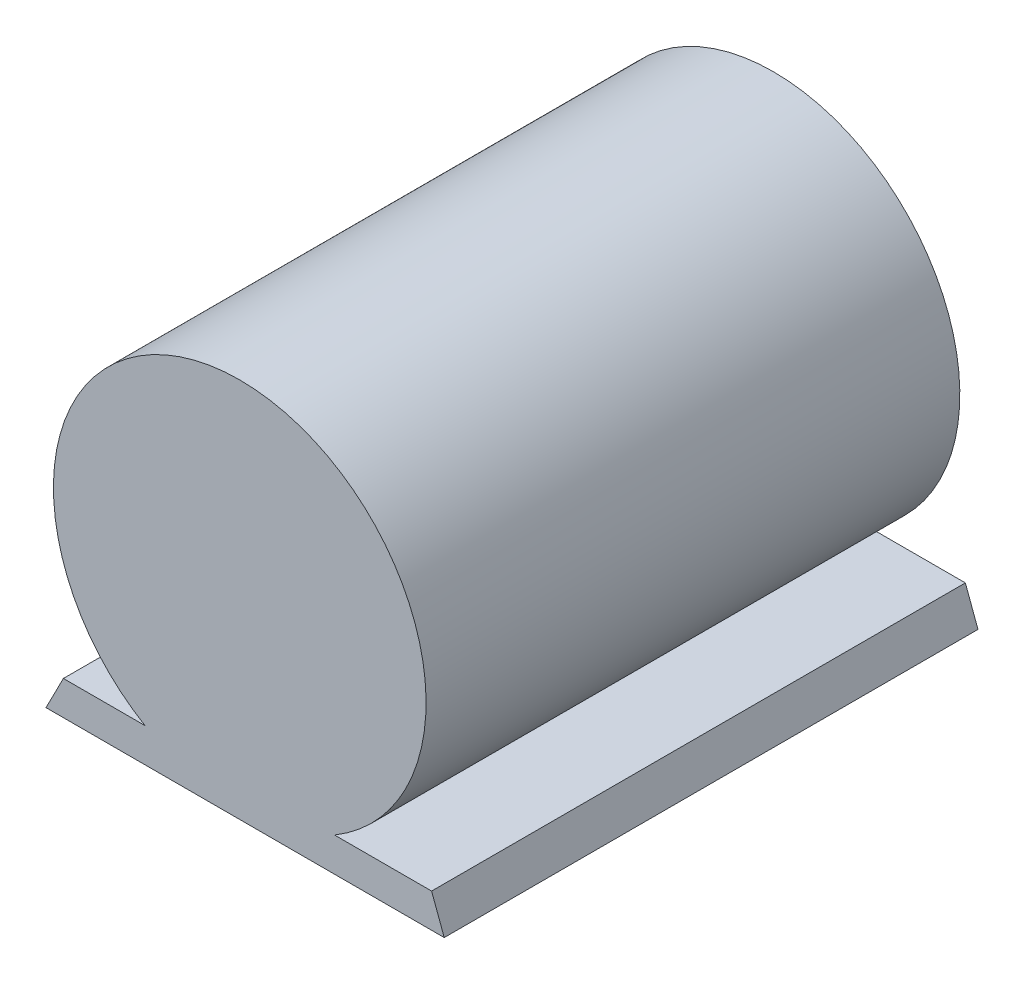
ISO-10303-21;
HEADER;
FILE_DESCRIPTION(('STEP AP214'),'2;1');
FILE_NAME('part.step','',(''),(''),'','','');
FILE_SCHEMA(('AUTOMOTIVE_DESIGN { 1 0 10303 214 1 1 1 1 }'));
ENDSEC;
DATA;
#1=APPLICATION_CONTEXT('core data for automotive mechanical design processes');
#2=APPLICATION_PROTOCOL_DEFINITION('international standard','automotive_design',2000,#1);
#3=PRODUCT_CONTEXT('',#1,'mechanical');
#4=PRODUCT('Part','Part','',(#3));
#5=PRODUCT_RELATED_PRODUCT_CATEGORY('part','',(#4));
#6=PRODUCT_DEFINITION_FORMATION('','',#4);
#7=PRODUCT_DEFINITION_CONTEXT('part definition',#1,'design');
#8=PRODUCT_DEFINITION('design','',#6,#7);
#9=PRODUCT_DEFINITION_SHAPE('','',#8);
#10=(LENGTH_UNIT() NAMED_UNIT(*) SI_UNIT(.MILLI.,.METRE.));
#11=(NAMED_UNIT(*) PLANE_ANGLE_UNIT() SI_UNIT($,.RADIAN.));
#12=(NAMED_UNIT(*) SI_UNIT($,.STERADIAN.) SOLID_ANGLE_UNIT());
#13=UNCERTAINTY_MEASURE_WITH_UNIT(LENGTH_MEASURE(1.E-05),#10,'distance_accuracy_value','');
#14=(GEOMETRIC_REPRESENTATION_CONTEXT(3) GLOBAL_UNCERTAINTY_ASSIGNED_CONTEXT((#13)) GLOBAL_UNIT_ASSIGNED_CONTEXT((#10,
#11,#12)) REPRESENTATION_CONTEXT('',''));
#15=CARTESIAN_POINT('',(0.,0.,0.));
#16=DIRECTION('',(0.,0.,1.));
#17=DIRECTION('',(1.,0.,0.));
#18=AXIS2_PLACEMENT_3D('',#15,#16,#17);
#19=CARTESIAN_POINT('',(0.,0.,167.));
#20=DIRECTION('',(0.,0.,-1.));
#21=DIRECTION('',(-1.,0.,0.));
#22=AXIS2_PLACEMENT_3D('',#19,#20,#21);
#23=CYLINDRICAL_SURFACE('',#22,65.);
#24=CARTESIAN_POINT('',(0.,0.,167.));
#25=DIRECTION('',(0.,0.,-1.));
#26=DIRECTION('',(-1.,0.,0.));
#27=AXIS2_PLACEMENT_3D('',#24,#25,#26);
#28=CIRCLE('',#27,65.);
#29=CARTESIAN_POINT('',(-65.,0.,167.));
#30=VERTEX_POINT('',#29);
#31=EDGE_CURVE('E261',#30,#30,#28,.T.);
#32=ORIENTED_EDGE('',*,*,#31,.F.);
#33=EDGE_LOOP('',(#32));
#34=FACE_BOUND('',#33,.T.);
#35=DIRECTION('',(0.,0.,-1.));
#36=VECTOR('',#35,1.);
#37=CARTESIAN_POINT('',(-48.6955872409807,-43.0550784839145,167.));
#38=LINE('',#37,#36);
#39=CARTESIAN_POINT('',(-48.6955872409807,-43.0550784839145,81.));
#40=VERTEX_POINT('',#39);
#41=CARTESIAN_POINT('',(-48.6955872409807,-43.0550784839145,83.9999999999999));
#42=VERTEX_POINT('',#41);
#43=EDGE_CURVE('E196',#40,#42,#38,.F.);
#44=ORIENTED_EDGE('',*,*,#43,.F.);
#45=CARTESIAN_POINT('',(0.,0.,81.));
#46=DIRECTION('',(0.,0.,-1.));
#47=DIRECTION('',(-1.,0.,0.));
#48=AXIS2_PLACEMENT_3D('',#45,#46,#47);
#49=CIRCLE('',#48,65.);
#50=CARTESIAN_POINT('',(-50.4248756332916,-41.0162396785356,81.));
#51=VERTEX_POINT('',#50);
#52=EDGE_CURVE('E185',#51,#40,#49,.F.);
#53=ORIENTED_EDGE('',*,*,#52,.F.);
#54=DIRECTION('',(0.,0.,-1.));
#55=VECTOR('',#54,1.);
#56=CARTESIAN_POINT('',(-50.4248756332916,-41.0162396785356,81.));
#57=LINE('',#56,#55);
#58=CARTESIAN_POINT('',(-50.4248756332916,-41.0162396785356,0.));
#59=VERTEX_POINT('',#58);
#60=EDGE_CURVE('E288',#51,#59,#57,.T.);
#61=ORIENTED_EDGE('',*,*,#60,.T.);
#62=CARTESIAN_POINT('',(0.,0.,0.));
#63=DIRECTION('',(0.,0.,-1.));
#64=DIRECTION('',(-1.,0.,0.));
#65=AXIS2_PLACEMENT_3D('',#62,#63,#64);
#66=CIRCLE('',#65,65.);
#67=CARTESIAN_POINT('',(50.4248756332916,-41.0162396785356,0.));
#68=VERTEX_POINT('',#67);
#69=EDGE_CURVE('E277',#59,#68,#66,.T.);
#70=ORIENTED_EDGE('',*,*,#69,.T.);
#71=DIRECTION('',(0.,0.,-1.));
#72=VECTOR('',#71,1.);
#73=CARTESIAN_POINT('',(50.4248756332916,-41.0162396785356,81.));
#74=LINE('',#73,#72);
#75=CARTESIAN_POINT('',(50.4248756332916,-41.0162396785356,81.));
#76=VERTEX_POINT('',#75);
#77=EDGE_CURVE('E285',#76,#68,#74,.T.);
#78=ORIENTED_EDGE('',*,*,#77,.F.);
#79=CARTESIAN_POINT('',(48.6955872409807,-43.0550784839145,81.));
#80=VERTEX_POINT('',#79);
#81=EDGE_CURVE('E194',#80,#76,#49,.F.);
#82=ORIENTED_EDGE('',*,*,#81,.F.);
#83=DIRECTION('',(0.,0.,-1.));
#84=VECTOR('',#83,1.);
#85=CARTESIAN_POINT('',(48.6955872409807,-43.0550784839145,167.));
#86=LINE('',#85,#84);
#87=CARTESIAN_POINT('',(48.6955872409807,-43.0550784839145,83.9999999999999));
#88=VERTEX_POINT('',#87);
#89=EDGE_CURVE('E57',#88,#80,#86,.T.);
#90=ORIENTED_EDGE('',*,*,#89,.F.);
#91=CARTESIAN_POINT('',(0.,0.,83.9999999999999));
#92=DIRECTION('',(0.,0.,1.));
#93=DIRECTION('',(1.,0.,0.));
#94=AXIS2_PLACEMENT_3D('',#91,#92,#93);
#95=CIRCLE('',#94,65.);
#96=EDGE_CURVE('E11',#88,#42,#95,.F.);
#97=ORIENTED_EDGE('',*,*,#96,.T.);
#98=EDGE_LOOP('',(#44,#53,#61,#70,#78,#82,#90,#97));
#99=FACE_BOUND('',#98,.T.);
#100=ADVANCED_FACE('F39',(#34,#99),#23,.F.);
#101=CARTESIAN_POINT('',(0.,0.,81.));
#102=DIRECTION('',(0.,0.,-1.));
#103=DIRECTION('',(-1.,0.,0.));
#104=AXIS2_PLACEMENT_3D('',#101,#102,#103);
#105=PLANE('',#104);
#106=DIRECTION('',(-1.,0.,0.));
#107=VECTOR('',#106,1.);
#108=CARTESIAN_POINT('',(0.,-43.0550784839145,81.));
#109=LINE('',#108,#107);
#110=CARTESIAN_POINT('',(46.0736904584768,-43.0550784839145,81.));
#111=VERTEX_POINT('',#110);
#112=EDGE_CURVE('E47',#80,#111,#109,.T.);
#113=ORIENTED_EDGE('',*,*,#112,.F.);
#114=ORIENTED_EDGE('',*,*,#81,.T.);
#115=DIRECTION('',(-1.,0.,0.));
#116=VECTOR('',#115,1.);
#117=CARTESIAN_POINT('',(0.,-41.0162396785356,81.));
#118=LINE('',#117,#116);
#119=CARTESIAN_POINT('',(47.8977329145388,-41.0162396785356,81.));
#120=VERTEX_POINT('',#119);
#121=EDGE_CURVE('E299',#76,#120,#118,.T.);
#122=ORIENTED_EDGE('',*,*,#121,.T.);
#123=CARTESIAN_POINT('',(0.,0.,81.));
#124=DIRECTION('',(0.,0.,-1.));
#125=DIRECTION('',(-1.,0.,0.));
#126=AXIS2_PLACEMENT_3D('',#123,#124,#125);
#127=CIRCLE('',#126,63.0596918460562);
#128=EDGE_CURVE('E301',#120,#111,#127,.T.);
#129=ORIENTED_EDGE('',*,*,#128,.T.);
#130=EDGE_LOOP('',(#113,#114,#122,#129));
#131=FACE_BOUND('',#130,.T.);
#132=ADVANCED_FACE('F357',(#131),#105,.F.);
#133=CARTESIAN_POINT('',(-46.0736904584768,-43.0550784839145,81.));
#134=VERTEX_POINT('',#133);
#135=EDGE_CURVE('E188',#134,#40,#109,.T.);
#136=ORIENTED_EDGE('',*,*,#135,.F.);
#137=CARTESIAN_POINT('',(-47.8977329145388,-41.0162396785356,81.));
#138=VERTEX_POINT('',#137);
#139=EDGE_CURVE('E305',#134,#138,#127,.T.);
#140=ORIENTED_EDGE('',*,*,#139,.T.);
#141=EDGE_CURVE('E191',#138,#51,#118,.T.);
#142=ORIENTED_EDGE('',*,*,#141,.T.);
#143=ORIENTED_EDGE('',*,*,#52,.T.);
#144=EDGE_LOOP('',(#136,#140,#142,#143));
#145=FACE_BOUND('',#144,.T.);
#146=ADVANCED_FACE('F186',(#145),#105,.F.);
#147=CARTESIAN_POINT('',(0.,0.,0.));
#148=DIRECTION('',(0.,0.,1.));
#149=DIRECTION('',(1.,0.,0.));
#150=AXIS2_PLACEMENT_3D('',#147,#148,#149);
#151=PLANE('',#150);
#152=DIRECTION('',(1.,0.,0.));
#153=VECTOR('',#152,1.);
#154=CARTESIAN_POINT('',(0.,-57.709462621464,0.));
#155=LINE('',#154,#153);
#156=CARTESIAN_POINT('',(34.0779263757812,-57.709462621464,0.));
#157=VERTEX_POINT('',#156);
#158=CARTESIAN_POINT('',(69.0070188719006,-57.709462621464,0.));
#159=VERTEX_POINT('',#158);
#160=EDGE_CURVE('E258',#157,#159,#155,.T.);
#161=ORIENTED_EDGE('',*,*,#160,.T.);
#162=DIRECTION('',(0.348733712021421,-0.937221851057561,0.));
#163=VECTOR('',#162,1.);
#164=CARTESIAN_POINT('',(41.7529062283023,15.5359651082057,0.));
#165=LINE('',#164,#163);
#166=CARTESIAN_POINT('',(73.5547213481586,-69.9314130264073,0.));
#167=VERTEX_POINT('',#166);
#168=EDGE_CURVE('E242',#159,#167,#165,.T.);
#169=ORIENTED_EDGE('',*,*,#168,.T.);
#170=DIRECTION('',(-1.,0.,0.));
#171=VECTOR('',#170,1.);
#172=CARTESIAN_POINT('',(0.,-69.9314130264073,0.));
#173=LINE('',#172,#171);
#174=CARTESIAN_POINT('',(-69.6979066539677,-69.9314130264073,0.));
#175=VERTEX_POINT('',#174);
#176=EDGE_CURVE('E246',#167,#175,#173,.T.);
#177=ORIENTED_EDGE('',*,*,#176,.T.);
#178=DIRECTION('',(0.455475804313987,0.890248162977339,0.));
#179=VECTOR('',#178,1.);
#180=CARTESIAN_POINT('',(-26.8822600429512,13.7537144405796,0.));
#181=LINE('',#180,#179);
#182=CARTESIAN_POINT('',(-63.444815749113,-57.709462621464,0.));
#183=VERTEX_POINT('',#182);
#184=EDGE_CURVE('E249',#175,#183,#181,.T.);
#185=ORIENTED_EDGE('',*,*,#184,.T.);
#186=DIRECTION('',(1.,0.,0.));
#187=VECTOR('',#186,1.);
#188=CARTESIAN_POINT('',(0.,-57.709462621464,0.));
#189=LINE('',#188,#187);
#190=CARTESIAN_POINT('',(-34.0779263757812,-57.709462621464,0.));
#191=VERTEX_POINT('',#190);
#192=EDGE_CURVE('E252',#183,#191,#189,.T.);
#193=ORIENTED_EDGE('',*,*,#192,.T.);
#194=CARTESIAN_POINT('',(0.,0.,0.));
#195=DIRECTION('',(0.,0.,1.));
#196=DIRECTION('',(1.,0.,0.));
#197=AXIS2_PLACEMENT_3D('',#194,#195,#196);
#198=CIRCLE('',#197,67.0200502993792);
#199=EDGE_CURVE('E255',#157,#191,#198,.T.);
#200=ORIENTED_EDGE('',*,*,#199,.F.);
#201=EDGE_LOOP('',(#161,#169,#177,#185,#193,#200));
#202=FACE_BOUND('',#201,.T.);
#203=ORIENTED_EDGE('',*,*,#69,.F.);
#204=DIRECTION('',(-1.,0.,0.));
#205=VECTOR('',#204,1.);
#206=CARTESIAN_POINT('',(0.,-41.0162396785356,0.));
#207=LINE('',#206,#205);
#208=CARTESIAN_POINT('',(-47.8977329145388,-41.0162396785356,0.));
#209=VERTEX_POINT('',#208);
#210=EDGE_CURVE('E294',#209,#59,#207,.T.);
#211=ORIENTED_EDGE('',*,*,#210,.F.);
#212=CARTESIAN_POINT('',(0.,0.,0.));
#213=DIRECTION('',(0.,0.,-1.));
#214=DIRECTION('',(-1.,0.,0.));
#215=AXIS2_PLACEMENT_3D('',#212,#213,#214);
#216=CIRCLE('',#215,63.0596918460562);
#217=CARTESIAN_POINT('',(47.8977329145388,-41.0162396785356,0.));
#218=VERTEX_POINT('',#217);
#219=EDGE_CURVE('E295',#218,#209,#216,.T.);
#220=ORIENTED_EDGE('',*,*,#219,.F.);
#221=EDGE_CURVE('E292',#68,#218,#207,.T.);
#222=ORIENTED_EDGE('',*,*,#221,.F.);
#223=EDGE_LOOP('',(#203,#211,#220,#222));
#224=FACE_BOUND('',#223,.T.);
#225=DIRECTION('',(0.,-1.,0.));
#226=VECTOR('',#225,1.);
#227=CARTESIAN_POINT('',(15.7467743465384,-63.592245322954,0.));
#228=LINE('',#227,#226);
#229=CARTESIAN_POINT('',(15.7467743465384,-63.592245322954,0.));
#230=VERTEX_POINT('',#229);
#231=CARTESIAN_POINT('',(15.7467743465384,-67.3975524836655,0.));
#232=VERTEX_POINT('',#231);
#233=EDGE_CURVE('E328',#230,#232,#228,.T.);
#234=ORIENTED_EDGE('',*,*,#233,.F.);
#235=DIRECTION('',(1.,0.,0.));
#236=VECTOR('',#235,1.);
#237=CARTESIAN_POINT('',(15.7467743465384,-63.592245322954,0.));
#238=LINE('',#237,#236);
#239=CARTESIAN_POINT('',(-15.9641186593907,-63.592245322954,0.));
#240=VERTEX_POINT('',#239);
#241=EDGE_CURVE('E318',#240,#230,#238,.T.);
#242=ORIENTED_EDGE('',*,*,#241,.F.);
#243=DIRECTION('',(0.,1.,0.));
#244=VECTOR('',#243,1.);
#245=CARTESIAN_POINT('',(-15.9641186593907,-63.592245322954,0.));
#246=LINE('',#245,#244);
#247=CARTESIAN_POINT('',(-15.9641186593907,-67.3975524836655,0.));
#248=VERTEX_POINT('',#247);
#249=EDGE_CURVE('E322',#248,#240,#246,.T.);
#250=ORIENTED_EDGE('',*,*,#249,.F.);
#251=DIRECTION('',(-1.,0.,0.));
#252=VECTOR('',#251,1.);
#253=CARTESIAN_POINT('',(15.7467743465384,-67.3975524836655,0.));
#254=LINE('',#253,#252);
#255=EDGE_CURVE('E325',#232,#248,#254,.T.);
#256=ORIENTED_EDGE('',*,*,#255,.F.);
#257=EDGE_LOOP('',(#234,#242,#250,#256));
#258=FACE_BOUND('',#257,.T.);
#259=ADVANCED_FACE('F375',(#202,#224,#258),#151,.F.);
#260=CARTESIAN_POINT('',(0.,-57.709462621464,192.));
#261=DIRECTION('',(0.,1.,0.));
#262=DIRECTION('',(0.,0.,1.));
#263=AXIS2_PLACEMENT_3D('',#260,#261,#262);
#264=PLANE('',#263);
#265=ORIENTED_EDGE('',*,*,#160,.F.);
#266=DIRECTION('',(0.,0.,-1.));
#267=VECTOR('',#266,1.);
#268=CARTESIAN_POINT('',(34.0779263757812,-57.709462621464,192.));
#269=LINE('',#268,#267);
#270=CARTESIAN_POINT('',(34.0779263757812,-57.709462621464,192.));
#271=VERTEX_POINT('',#270);
#272=EDGE_CURVE('E229',#271,#157,#269,.T.);
#273=ORIENTED_EDGE('',*,*,#272,.F.);
#274=DIRECTION('',(1.,0.,0.));
#275=VECTOR('',#274,1.);
#276=CARTESIAN_POINT('',(0.,-57.709462621464,192.));
#277=LINE('',#276,#275);
#278=CARTESIAN_POINT('',(69.0070188719006,-57.709462621464,192.));
#279=VERTEX_POINT('',#278);
#280=EDGE_CURVE('E245',#271,#279,#277,.T.);
#281=ORIENTED_EDGE('',*,*,#280,.T.);
#282=DIRECTION('',(0.,0.,-1.));
#283=VECTOR('',#282,1.);
#284=CARTESIAN_POINT('',(69.0070188719006,-57.709462621464,192.));
#285=LINE('',#284,#283);
#286=EDGE_CURVE('E239',#279,#159,#285,.T.);
#287=ORIENTED_EDGE('',*,*,#286,.T.);
#288=EDGE_LOOP('',(#265,#273,#281,#287));
#289=FACE_BOUND('',#288,.T.);
#290=ADVANCED_FACE('F378',(#289),#264,.T.);
#291=CARTESIAN_POINT('',(0.,0.,192.));
#292=DIRECTION('',(0.,0.,-1.));
#293=DIRECTION('',(-1.,0.,0.));
#294=AXIS2_PLACEMENT_3D('',#291,#292,#293);
#295=CYLINDRICAL_SURFACE('',#294,67.0200502993792);
#296=ORIENTED_EDGE('',*,*,#199,.T.);
#297=DIRECTION('',(0.,0.,-1.));
#298=VECTOR('',#297,1.);
#299=CARTESIAN_POINT('',(-34.0779263757812,-57.709462621464,192.));
#300=LINE('',#299,#298);
#301=CARTESIAN_POINT('',(-34.0779263757812,-57.709462621464,192.));
#302=VERTEX_POINT('',#301);
#303=EDGE_CURVE('E231',#302,#191,#300,.T.);
#304=ORIENTED_EDGE('',*,*,#303,.F.);
#305=CARTESIAN_POINT('',(0.,0.,192.));
#306=DIRECTION('',(0.,0.,1.));
#307=DIRECTION('',(1.,0.,0.));
#308=AXIS2_PLACEMENT_3D('',#305,#306,#307);
#309=CIRCLE('',#308,67.0200502993792);
#310=EDGE_CURVE('E273',#271,#302,#309,.T.);
#311=ORIENTED_EDGE('',*,*,#310,.F.);
#312=ORIENTED_EDGE('',*,*,#272,.T.);
#313=EDGE_LOOP('',(#296,#304,#311,#312));
#314=FACE_BOUND('',#313,.T.);
#315=ADVANCED_FACE('F459',(#314),#295,.T.);
#316=CARTESIAN_POINT('',(0.,-57.709462621464,192.));
#317=DIRECTION('',(0.,1.,0.));
#318=DIRECTION('',(0.,0.,1.));
#319=AXIS2_PLACEMENT_3D('',#316,#317,#318);
#320=PLANE('',#319);
#321=ORIENTED_EDGE('',*,*,#192,.F.);
#322=DIRECTION('',(0.,0.,-1.));
#323=VECTOR('',#322,1.);
#324=CARTESIAN_POINT('',(-63.444815749113,-57.709462621464,192.));
#325=LINE('',#324,#323);
#326=CARTESIAN_POINT('',(-63.444815749113,-57.709462621464,192.));
#327=VERTEX_POINT('',#326);
#328=EDGE_CURVE('E233',#327,#183,#325,.T.);
#329=ORIENTED_EDGE('',*,*,#328,.F.);
#330=DIRECTION('',(1.,0.,0.));
#331=VECTOR('',#330,1.);
#332=CARTESIAN_POINT('',(0.,-57.709462621464,192.));
#333=LINE('',#332,#331);
#334=EDGE_CURVE('E270',#327,#302,#333,.T.);
#335=ORIENTED_EDGE('',*,*,#334,.T.);
#336=ORIENTED_EDGE('',*,*,#303,.T.);
#337=EDGE_LOOP('',(#321,#329,#335,#336));
#338=FACE_BOUND('',#337,.T.);
#339=ADVANCED_FACE('F455',(#338),#320,.T.);
#340=CARTESIAN_POINT('',(-26.8822600429512,13.7537144405796,192.));
#341=DIRECTION('',(-0.890248162977339,0.455475804313987,0.));
#342=DIRECTION('',(-0.455475804313987,-0.890248162977339,0.));
#343=AXIS2_PLACEMENT_3D('',#340,#341,#342);
#344=PLANE('',#343);
#345=ORIENTED_EDGE('',*,*,#184,.F.);
#346=DIRECTION('',(0.,0.,-1.));
#347=VECTOR('',#346,1.);
#348=CARTESIAN_POINT('',(-69.6979066539677,-69.9314130264073,192.));
#349=LINE('',#348,#347);
#350=CARTESIAN_POINT('',(-69.6979066539677,-69.9314130264073,192.));
#351=VERTEX_POINT('',#350);
#352=EDGE_CURVE('E235',#351,#175,#349,.T.);
#353=ORIENTED_EDGE('',*,*,#352,.F.);
#354=DIRECTION('',(0.455475804313987,0.890248162977339,0.));
#355=VECTOR('',#354,1.);
#356=CARTESIAN_POINT('',(-26.8822600429512,13.7537144405796,192.));
#357=LINE('',#356,#355);
#358=EDGE_CURVE('E267',#351,#327,#357,.T.);
#359=ORIENTED_EDGE('',*,*,#358,.T.);
#360=ORIENTED_EDGE('',*,*,#328,.T.);
#361=EDGE_LOOP('',(#345,#353,#359,#360));
#362=FACE_BOUND('',#361,.T.);
#363=ADVANCED_FACE('F451',(#362),#344,.T.);
#364=CARTESIAN_POINT('',(0.,-69.9314130264073,192.));
#365=DIRECTION('',(0.,-1.,0.));
#366=DIRECTION('',(0.,0.,-1.));
#367=AXIS2_PLACEMENT_3D('',#364,#365,#366);
#368=PLANE('',#367);
#369=ORIENTED_EDGE('',*,*,#176,.F.);
#370=DIRECTION('',(0.,0.,-1.));
#371=VECTOR('',#370,1.);
#372=CARTESIAN_POINT('',(73.5547213481586,-69.9314130264073,192.));
#373=LINE('',#372,#371);
#374=CARTESIAN_POINT('',(73.5547213481586,-69.9314130264073,192.));
#375=VERTEX_POINT('',#374);
#376=EDGE_CURVE('E237',#375,#167,#373,.T.);
#377=ORIENTED_EDGE('',*,*,#376,.F.);
#378=DIRECTION('',(-1.,0.,0.));
#379=VECTOR('',#378,1.);
#380=CARTESIAN_POINT('',(0.,-69.9314130264073,192.));
#381=LINE('',#380,#379);
#382=EDGE_CURVE('E264',#375,#351,#381,.T.);
#383=ORIENTED_EDGE('',*,*,#382,.T.);
#384=ORIENTED_EDGE('',*,*,#352,.T.);
#385=EDGE_LOOP('',(#369,#377,#383,#384));
#386=FACE_BOUND('',#385,.T.);
#387=ADVANCED_FACE('F447',(#386),#368,.T.);
#388=CARTESIAN_POINT('',(41.7529062283023,15.5359651082057,192.));
#389=DIRECTION('',(0.937221851057561,0.348733712021421,0.));
#390=DIRECTION('',(-0.348733712021421,0.937221851057561,0.));
#391=AXIS2_PLACEMENT_3D('',#388,#389,#390);
#392=PLANE('',#391);
#393=ORIENTED_EDGE('',*,*,#168,.F.);
#394=ORIENTED_EDGE('',*,*,#286,.F.);
#395=DIRECTION('',(0.348733712021421,-0.937221851057561,0.));
#396=VECTOR('',#395,1.);
#397=CARTESIAN_POINT('',(41.7529062283023,15.5359651082057,192.));
#398=LINE('',#397,#396);
#399=EDGE_CURVE('E241',#279,#375,#398,.T.);
#400=ORIENTED_EDGE('',*,*,#399,.T.);
#401=ORIENTED_EDGE('',*,*,#376,.T.);
#402=EDGE_LOOP('',(#393,#394,#400,#401));
#403=FACE_BOUND('',#402,.T.);
#404=ADVANCED_FACE('F442',(#403),#392,.T.);
#405=CARTESIAN_POINT('',(0.,0.,192.));
#406=DIRECTION('',(0.,0.,1.));
#407=DIRECTION('',(1.,0.,0.));
#408=AXIS2_PLACEMENT_3D('',#405,#406,#407);
#409=PLANE('',#408);
#410=ORIENTED_EDGE('',*,*,#280,.F.);
#411=ORIENTED_EDGE('',*,*,#310,.T.);
#412=ORIENTED_EDGE('',*,*,#334,.F.);
#413=ORIENTED_EDGE('',*,*,#358,.F.);
#414=ORIENTED_EDGE('',*,*,#382,.F.);
#415=ORIENTED_EDGE('',*,*,#399,.F.);
#416=EDGE_LOOP('',(#410,#411,#412,#413,#414,#415));
#417=FACE_BOUND('',#416,.T.);
#418=ADVANCED_FACE('F439',(#417),#409,.T.);
#419=CARTESIAN_POINT('',(0.,0.,167.));
#420=DIRECTION('',(0.,0.,-1.));
#421=DIRECTION('',(-1.,0.,0.));
#422=AXIS2_PLACEMENT_3D('',#419,#420,#421);
#423=PLANE('',#422);
#424=ORIENTED_EDGE('',*,*,#31,.T.);
#425=EDGE_LOOP('',(#424));
#426=FACE_BOUND('',#425,.T.);
#427=ADVANCED_FACE('F436',(#426),#423,.T.);
#428=CARTESIAN_POINT('',(0.,0.,81.));
#429=DIRECTION('',(0.,0.,-1.));
#430=DIRECTION('',(-1.,0.,0.));
#431=AXIS2_PLACEMENT_3D('',#428,#429,#430);
#432=CYLINDRICAL_SURFACE('',#431,63.0596918460562);
#433=ORIENTED_EDGE('',*,*,#219,.T.);
#434=DIRECTION('',(0.,0.,-1.));
#435=VECTOR('',#434,1.);
#436=CARTESIAN_POINT('',(-47.8977329145388,-41.0162396785356,81.));
#437=LINE('',#436,#435);
#438=EDGE_CURVE('E279',#138,#209,#437,.T.);
#439=ORIENTED_EDGE('',*,*,#438,.F.);
#440=ORIENTED_EDGE('',*,*,#139,.F.);
#441=EDGE_CURVE('E304',#111,#134,#127,.T.);
#442=ORIENTED_EDGE('',*,*,#441,.F.);
#443=ORIENTED_EDGE('',*,*,#128,.F.);
#444=DIRECTION('',(0.,0.,-1.));
#445=VECTOR('',#444,1.);
#446=CARTESIAN_POINT('',(47.8977329145388,-41.0162396785356,81.));
#447=LINE('',#446,#445);
#448=EDGE_CURVE('E282',#120,#218,#447,.T.);
#449=ORIENTED_EDGE('',*,*,#448,.T.);
#450=EDGE_LOOP('',(#433,#439,#440,#442,#443,#449));
#451=FACE_BOUND('',#450,.T.);
#452=ADVANCED_FACE('F367',(#451),#432,.F.);
#453=CARTESIAN_POINT('',(0.,-41.0162396785356,81.));
#454=DIRECTION('',(0.,-1.,0.));
#455=DIRECTION('',(0.,0.,-1.));
#456=AXIS2_PLACEMENT_3D('',#453,#454,#455);
#457=PLANE('',#456);
#458=ORIENTED_EDGE('',*,*,#210,.T.);
#459=ORIENTED_EDGE('',*,*,#60,.F.);
#460=ORIENTED_EDGE('',*,*,#141,.F.);
#461=ORIENTED_EDGE('',*,*,#438,.T.);
#462=EDGE_LOOP('',(#458,#459,#460,#461));
#463=FACE_BOUND('',#462,.T.);
#464=ADVANCED_FACE('F373',(#463),#457,.F.);
#465=ORIENTED_EDGE('',*,*,#221,.T.);
#466=ORIENTED_EDGE('',*,*,#448,.F.);
#467=ORIENTED_EDGE('',*,*,#121,.F.);
#468=ORIENTED_EDGE('',*,*,#77,.T.);
#469=EDGE_LOOP('',(#465,#466,#467,#468));
#470=FACE_BOUND('',#469,.T.);
#471=ADVANCED_FACE('F364',(#470),#457,.F.);
#472=CARTESIAN_POINT('',(15.7467743465384,-63.592245322954,-6.99999999999996));
#473=DIRECTION('',(-1.,0.,0.));
#474=DIRECTION('',(0.,0.,1.));
#475=AXIS2_PLACEMENT_3D('',#472,#473,#474);
#476=PLANE('',#475);
#477=ORIENTED_EDGE('',*,*,#233,.T.);
#478=DIRECTION('',(0.,0.,1.));
#479=VECTOR('',#478,1.);
#480=CARTESIAN_POINT('',(15.7467743465384,-67.3975524836655,-6.99999999999996));
#481=LINE('',#480,#479);
#482=CARTESIAN_POINT('',(15.7467743465384,-67.3975524836655,-6.99999999999996));
#483=VERTEX_POINT('',#482);
#484=EDGE_CURVE('E297',#483,#232,#481,.T.);
#485=ORIENTED_EDGE('',*,*,#484,.F.);
#486=DIRECTION('',(0.,-1.,0.));
#487=VECTOR('',#486,1.);
#488=CARTESIAN_POINT('',(15.7467743465384,-63.592245322954,-6.99999999999996));
#489=LINE('',#488,#487);
#490=CARTESIAN_POINT('',(15.7467743465384,-63.592245322954,-6.99999999999996));
#491=VERTEX_POINT('',#490);
#492=EDGE_CURVE('E321',#491,#483,#489,.T.);
#493=ORIENTED_EDGE('',*,*,#492,.F.);
#494=DIRECTION('',(0.,0.,1.));
#495=VECTOR('',#494,1.);
#496=CARTESIAN_POINT('',(15.7467743465384,-63.592245322954,-6.99999999999996));
#497=LINE('',#496,#495);
#498=EDGE_CURVE('E314',#491,#230,#497,.T.);
#499=ORIENTED_EDGE('',*,*,#498,.T.);
#500=EDGE_LOOP('',(#477,#485,#493,#499));
#501=FACE_BOUND('',#500,.T.);
#502=ADVANCED_FACE('F390',(#501),#476,.F.);
#503=CARTESIAN_POINT('',(15.7467743465384,-67.3975524836655,-6.99999999999996));
#504=DIRECTION('',(0.,1.,0.));
#505=DIRECTION('',(0.,0.,1.));
#506=AXIS2_PLACEMENT_3D('',#503,#504,#505);
#507=PLANE('',#506);
#508=ORIENTED_EDGE('',*,*,#255,.T.);
#509=DIRECTION('',(0.,0.,1.));
#510=VECTOR('',#509,1.);
#511=CARTESIAN_POINT('',(-15.9641186593907,-67.3975524836655,-6.99999999999996));
#512=LINE('',#511,#510);
#513=CARTESIAN_POINT('',(-15.9641186593907,-67.3975524836655,-6.99999999999996));
#514=VERTEX_POINT('',#513);
#515=EDGE_CURVE('E308',#514,#248,#512,.T.);
#516=ORIENTED_EDGE('',*,*,#515,.F.);
#517=DIRECTION('',(-1.,0.,0.));
#518=VECTOR('',#517,1.);
#519=CARTESIAN_POINT('',(15.7467743465384,-67.3975524836655,-6.99999999999996));
#520=LINE('',#519,#518);
#521=EDGE_CURVE('E337',#483,#514,#520,.T.);
#522=ORIENTED_EDGE('',*,*,#521,.F.);
#523=ORIENTED_EDGE('',*,*,#484,.T.);
#524=EDGE_LOOP('',(#508,#516,#522,#523));
#525=FACE_BOUND('',#524,.T.);
#526=ADVANCED_FACE('F557',(#525),#507,.F.);
#527=CARTESIAN_POINT('',(-15.9641186593907,-63.592245322954,-6.99999999999996));
#528=DIRECTION('',(1.,0.,0.));
#529=DIRECTION('',(0.,0.,-1.));
#530=AXIS2_PLACEMENT_3D('',#527,#528,#529);
#531=PLANE('',#530);
#532=ORIENTED_EDGE('',*,*,#249,.T.);
#533=DIRECTION('',(0.,0.,1.));
#534=VECTOR('',#533,1.);
#535=CARTESIAN_POINT('',(-15.9641186593907,-63.592245322954,-6.99999999999996));
#536=LINE('',#535,#534);
#537=CARTESIAN_POINT('',(-15.9641186593907,-63.592245322954,-6.99999999999996));
#538=VERTEX_POINT('',#537);
#539=EDGE_CURVE('E311',#538,#240,#536,.T.);
#540=ORIENTED_EDGE('',*,*,#539,.F.);
#541=DIRECTION('',(0.,1.,0.));
#542=VECTOR('',#541,1.);
#543=CARTESIAN_POINT('',(-15.9641186593907,-63.592245322954,-6.99999999999996));
#544=LINE('',#543,#542);
#545=EDGE_CURVE('E335',#514,#538,#544,.T.);
#546=ORIENTED_EDGE('',*,*,#545,.F.);
#547=ORIENTED_EDGE('',*,*,#515,.T.);
#548=EDGE_LOOP('',(#532,#540,#546,#547));
#549=FACE_BOUND('',#548,.T.);
#550=ADVANCED_FACE('F549',(#549),#531,.F.);
#551=CARTESIAN_POINT('',(15.7467743465384,-63.592245322954,-6.99999999999996));
#552=DIRECTION('',(0.,-1.,0.));
#553=DIRECTION('',(0.,0.,-1.));
#554=AXIS2_PLACEMENT_3D('',#551,#552,#553);
#555=PLANE('',#554);
#556=DIRECTION('',(-1.,0.,0.));
#557=VECTOR('',#556,1.);
#558=CARTESIAN_POINT('',(0.,-63.592245322954,-6.42880048405429));
#559=LINE('',#558,#557);
#560=CARTESIAN_POINT('',(6.11593202273053,-63.592245322954,-6.42880048405429));
#561=VERTEX_POINT('',#560);
#562=CARTESIAN_POINT('',(-6.11593202273053,-63.592245322954,-6.42880048405429));
#563=VERTEX_POINT('',#562);
#564=EDGE_CURVE('E227',#561,#563,#559,.T.);
#565=ORIENTED_EDGE('',*,*,#564,.T.);
#566=CARTESIAN_POINT('',(-7.87687728271377,-63.592245322954,-3.99999999999996));
#567=DIRECTION('',(0.,-1.,0.));
#568=DIRECTION('',(0.,0.,-1.));
#569=AXIS2_PLACEMENT_3D('',#566,#567,#568);
#570=CIRCLE('',#569,3.);
#571=CARTESIAN_POINT('',(-7.87687728271377,-63.592245322954,-6.99999999999996));
#572=VERTEX_POINT('',#571);
#573=EDGE_CURVE('E223',#563,#572,#570,.F.);
#574=ORIENTED_EDGE('',*,*,#573,.T.);
#575=DIRECTION('',(1.,0.,0.));
#576=VECTOR('',#575,1.);
#577=CARTESIAN_POINT('',(15.7467743465384,-63.592245322954,-6.99999999999996));
#578=LINE('',#577,#576);
#579=EDGE_CURVE('E317',#538,#572,#578,.T.);
#580=ORIENTED_EDGE('',*,*,#579,.F.);
#581=ORIENTED_EDGE('',*,*,#539,.T.);
#582=ORIENTED_EDGE('',*,*,#241,.T.);
#583=ORIENTED_EDGE('',*,*,#498,.F.);
#584=CARTESIAN_POINT('',(7.87687728271377,-63.592245322954,-6.99999999999996));
#585=VERTEX_POINT('',#584);
#586=EDGE_CURVE('E334',#585,#491,#578,.T.);
#587=ORIENTED_EDGE('',*,*,#586,.F.);
#588=CARTESIAN_POINT('',(7.87687728271377,-63.592245322954,-3.99999999999996));
#589=DIRECTION('',(0.,-1.,0.));
#590=DIRECTION('',(0.,0.,-1.));
#591=AXIS2_PLACEMENT_3D('',#588,#589,#590);
#592=CIRCLE('',#591,3.);
#593=EDGE_CURVE('E225',#585,#561,#592,.F.);
#594=ORIENTED_EDGE('',*,*,#593,.T.);
#595=EDGE_LOOP('',(#565,#574,#580,#581,#582,#583,#587,#594));
#596=FACE_BOUND('',#595,.T.);
#597=ADVANCED_FACE('F385',(#596),#555,.F.);
#598=CARTESIAN_POINT('',(0.,0.,-6.99999999999996));
#599=DIRECTION('',(0.,0.,-1.));
#600=DIRECTION('',(-1.,0.,0.));
#601=AXIS2_PLACEMENT_3D('',#598,#599,#600);
#602=PLANE('',#601);
#603=ORIENTED_EDGE('',*,*,#579,.T.);
#604=DIRECTION('',(0.,1.,0.));
#605=VECTOR('',#604,1.);
#606=CARTESIAN_POINT('',(-7.87687728271377,-66.7917135260966,-6.99999999999996));
#607=LINE('',#606,#605);
#608=CARTESIAN_POINT('',(-7.87687728271377,-66.7917135260966,-6.99999999999996));
#609=VERTEX_POINT('',#608);
#610=EDGE_CURVE('E218',#572,#609,#607,.F.);
#611=ORIENTED_EDGE('',*,*,#610,.T.);
#612=DIRECTION('',(-1.,0.,0.));
#613=VECTOR('',#612,1.);
#614=CARTESIAN_POINT('',(4.87687728271377,-66.7917135260966,-6.99999999999996));
#615=LINE('',#614,#613);
#616=CARTESIAN_POINT('',(7.87687728271377,-66.7917135260966,-6.99999999999996));
#617=VERTEX_POINT('',#616);
#618=EDGE_CURVE('E215',#617,#609,#615,.T.);
#619=ORIENTED_EDGE('',*,*,#618,.F.);
#620=DIRECTION('',(0.,-1.,0.));
#621=VECTOR('',#620,1.);
#622=CARTESIAN_POINT('',(7.87687728271377,-64.8313000629708,-6.99999999999996));
#623=LINE('',#622,#621);
#624=EDGE_CURVE('E221',#617,#585,#623,.F.);
#625=ORIENTED_EDGE('',*,*,#624,.T.);
#626=ORIENTED_EDGE('',*,*,#586,.T.);
#627=ORIENTED_EDGE('',*,*,#492,.T.);
#628=ORIENTED_EDGE('',*,*,#521,.T.);
#629=ORIENTED_EDGE('',*,*,#545,.T.);
#630=EDGE_LOOP('',(#603,#611,#619,#625,#626,#627,#628,#629));
#631=FACE_BOUND('',#630,.T.);
#632=ADVANCED_FACE('F392',(#631),#602,.T.);
#633=CARTESIAN_POINT('',(4.87687728271377,-66.7917135260966,-4.));
#634=DIRECTION('',(0.,-1.,0.));
#635=DIRECTION('',(0.,0.,-1.));
#636=AXIS2_PLACEMENT_3D('',#633,#634,#635);
#637=PLANE('',#636);
#638=ORIENTED_EDGE('',*,*,#618,.T.);
#639=CARTESIAN_POINT('',(-7.87687728271377,-66.7917135260966,-3.99999999999996));
#640=DIRECTION('',(0.,-1.,0.));
#641=DIRECTION('',(0.,0.,-1.));
#642=AXIS2_PLACEMENT_3D('',#639,#640,#641);
#643=CIRCLE('',#642,3.);
#644=CARTESIAN_POINT('',(-4.87687728271377,-66.7917135260966,-4.));
#645=VERTEX_POINT('',#644);
#646=EDGE_CURVE('E209',#609,#645,#643,.T.);
#647=ORIENTED_EDGE('',*,*,#646,.T.);
#648=DIRECTION('',(-1.,0.,0.));
#649=VECTOR('',#648,1.);
#650=CARTESIAN_POINT('',(4.87687728271377,-66.7917135260966,-4.));
#651=LINE('',#650,#649);
#652=CARTESIAN_POINT('',(4.87687728271377,-66.7917135260966,-4.));
#653=VERTEX_POINT('',#652);
#654=EDGE_CURVE('E331',#653,#645,#651,.T.);
#655=ORIENTED_EDGE('',*,*,#654,.F.);
#656=CARTESIAN_POINT('',(7.87687728271377,-66.7917135260966,-3.99999999999996));
#657=DIRECTION('',(0.,-1.,0.));
#658=DIRECTION('',(0.,0.,-1.));
#659=AXIS2_PLACEMENT_3D('',#656,#657,#658);
#660=CIRCLE('',#659,3.);
#661=EDGE_CURVE('E207',#653,#617,#660,.T.);
#662=ORIENTED_EDGE('',*,*,#661,.T.);
#663=EDGE_LOOP('',(#638,#647,#655,#662));
#664=FACE_BOUND('',#663,.T.);
#665=ADVANCED_FACE('F414',(#664),#637,.F.);
#666=CARTESIAN_POINT('',(0.,0.,-4.));
#667=DIRECTION('',(0.,0.,1.));
#668=DIRECTION('',(1.,0.,0.));
#669=AXIS2_PLACEMENT_3D('',#666,#667,#668);
#670=PLANE('',#669);
#671=DIRECTION('',(0.,1.,0.));
#672=VECTOR('',#671,1.);
#673=CARTESIAN_POINT('',(-4.87687728271377,-66.7917135260966,-4.));
#674=LINE('',#673,#672);
#675=CARTESIAN_POINT('',(-4.87687728271377,-64.8313000629708,-4.));
#676=VERTEX_POINT('',#675);
#677=EDGE_CURVE('E342',#645,#676,#674,.T.);
#678=ORIENTED_EDGE('',*,*,#677,.T.);
#679=DIRECTION('',(1.,0.,0.));
#680=VECTOR('',#679,1.);
#681=CARTESIAN_POINT('',(4.87687728271377,-64.8313000629708,-4.));
#682=LINE('',#681,#680);
#683=CARTESIAN_POINT('',(4.87687728271377,-64.8313000629708,-4.));
#684=VERTEX_POINT('',#683);
#685=EDGE_CURVE('E347',#676,#684,#682,.T.);
#686=ORIENTED_EDGE('',*,*,#685,.T.);
#687=DIRECTION('',(0.,-1.,0.));
#688=VECTOR('',#687,1.);
#689=CARTESIAN_POINT('',(4.87687728271377,-66.7917135260966,-4.));
#690=LINE('',#689,#688);
#691=EDGE_CURVE('E345',#684,#653,#690,.T.);
#692=ORIENTED_EDGE('',*,*,#691,.T.);
#693=ORIENTED_EDGE('',*,*,#654,.T.);
#694=EDGE_LOOP('',(#678,#686,#692,#693));
#695=FACE_BOUND('',#694,.T.);
#696=ADVANCED_FACE('F416',(#695),#670,.F.);
#697=CARTESIAN_POINT('',(7.87687728271377,-66.7917135260966,-3.99999999999996));
#698=DIRECTION('',(0.,1.,0.));
#699=DIRECTION('',(0.,0.,1.));
#700=AXIS2_PLACEMENT_3D('',#697,#698,#699);
#701=CYLINDRICAL_SURFACE('',#700,3.);
#702=ORIENTED_EDGE('',*,*,#661,.F.);
#703=ORIENTED_EDGE('',*,*,#691,.F.);
#704=CARTESIAN_POINT('',(7.87687728271377,-61.8313000629707,-3.99999999999996));
#705=DIRECTION('',(-0.707106781186547,0.707106781186547,0.));
#706=DIRECTION('',(-0.707106781186547,-0.707106781186547,0.));
#707=AXIS2_PLACEMENT_3D('',#704,#705,#706);
#708=ELLIPSE('',#707,4.24264068711928,3.);
#709=EDGE_CURVE('E212',#561,#684,#708,.T.);
#710=ORIENTED_EDGE('',*,*,#709,.F.);
#711=ORIENTED_EDGE('',*,*,#593,.F.);
#712=ORIENTED_EDGE('',*,*,#624,.F.);
#713=EDGE_LOOP('',(#702,#703,#710,#711,#712));
#714=FACE_BOUND('',#713,.T.);
#715=ADVANCED_FACE('F41',(#714),#701,.T.);
#716=CARTESIAN_POINT('',(4.87687728271377,-61.8313000629707,-3.99999999999996));
#717=DIRECTION('',(-1.,0.,0.));
#718=DIRECTION('',(0.,0.,1.));
#719=AXIS2_PLACEMENT_3D('',#716,#717,#718);
#720=CYLINDRICAL_SURFACE('',#719,3.);
#721=ORIENTED_EDGE('',*,*,#709,.T.);
#722=ORIENTED_EDGE('',*,*,#685,.F.);
#723=CARTESIAN_POINT('',(-7.87687728271377,-61.8313000629707,-3.99999999999996));
#724=DIRECTION('',(-0.707106781186547,-0.707106781186547,0.));
#725=DIRECTION('',(-0.707106781186547,0.707106781186547,0.));
#726=AXIS2_PLACEMENT_3D('',#723,#724,#725);
#727=ELLIPSE('',#726,4.24264068711928,3.);
#728=EDGE_CURVE('E200',#563,#676,#727,.T.);
#729=ORIENTED_EDGE('',*,*,#728,.F.);
#730=ORIENTED_EDGE('',*,*,#564,.F.);
#731=EDGE_LOOP('',(#721,#722,#729,#730));
#732=FACE_BOUND('',#731,.T.);
#733=ADVANCED_FACE('F404',(#732),#720,.T.);
#734=CARTESIAN_POINT('',(-7.87687728271377,-66.7917135260966,-3.99999999999996));
#735=DIRECTION('',(0.,-1.,0.));
#736=DIRECTION('',(0.,0.,-1.));
#737=AXIS2_PLACEMENT_3D('',#734,#735,#736);
#738=CYLINDRICAL_SURFACE('',#737,3.);
#739=ORIENTED_EDGE('',*,*,#646,.F.);
#740=ORIENTED_EDGE('',*,*,#610,.F.);
#741=ORIENTED_EDGE('',*,*,#573,.F.);
#742=ORIENTED_EDGE('',*,*,#728,.T.);
#743=ORIENTED_EDGE('',*,*,#677,.F.);
#744=EDGE_LOOP('',(#739,#740,#741,#742,#743));
#745=FACE_BOUND('',#744,.T.);
#746=ADVANCED_FACE('F410',(#745),#738,.T.);
#747=CARTESIAN_POINT('',(0.,0.,83.9999999999999));
#748=DIRECTION('',(0.,0.,1.));
#749=DIRECTION('',(1.,0.,0.));
#750=AXIS2_PLACEMENT_3D('',#747,#748,#749);
#751=PLANE('',#750);
#752=ORIENTED_EDGE('',*,*,#96,.F.);
#753=DIRECTION('',(-1.,0.,0.));
#754=VECTOR('',#753,1.);
#755=CARTESIAN_POINT('',(-49.3548408224987,-43.0550784839145,83.9999999999999));
#756=LINE('',#755,#754);
#757=EDGE_CURVE('E352',#88,#42,#756,.T.);
#758=ORIENTED_EDGE('',*,*,#757,.T.);
#759=EDGE_LOOP('',(#752,#758));
#760=FACE_BOUND('',#759,.T.);
#761=ADVANCED_FACE('F355',(#760),#751,.T.);
#762=CARTESIAN_POINT('',(0.,0.,81.));
#763=DIRECTION('',(0.,0.,1.));
#764=DIRECTION('',(1.,0.,0.));
#765=AXIS2_PLACEMENT_3D('',#762,#763,#764);
#766=PLANE('',#765);
#767=DIRECTION('',(-1.,0.,0.));
#768=VECTOR('',#767,1.);
#769=CARTESIAN_POINT('',(-49.3548408224987,-43.0550784839145,81.));
#770=LINE('',#769,#768);
#771=EDGE_CURVE('E206',#111,#134,#770,.T.);
#772=ORIENTED_EDGE('',*,*,#771,.F.);
#773=ORIENTED_EDGE('',*,*,#441,.T.);
#774=EDGE_LOOP('',(#772,#773));
#775=FACE_BOUND('',#774,.T.);
#776=ADVANCED_FACE('F483',(#775),#766,.F.);
#777=CARTESIAN_POINT('',(-49.3548408224987,-43.0550784839145,83.9999999999999));
#778=DIRECTION('',(0.,-1.,0.));
#779=DIRECTION('',(0.,0.,-1.));
#780=AXIS2_PLACEMENT_3D('',#777,#778,#779);
#781=PLANE('',#780);
#782=ORIENTED_EDGE('',*,*,#135,.T.);
#783=ORIENTED_EDGE('',*,*,#43,.T.);
#784=ORIENTED_EDGE('',*,*,#757,.F.);
#785=ORIENTED_EDGE('',*,*,#89,.T.);
#786=ORIENTED_EDGE('',*,*,#112,.T.);
#787=ORIENTED_EDGE('',*,*,#771,.T.);
#788=EDGE_LOOP('',(#782,#783,#784,#785,#786,#787));
#789=FACE_BOUND('',#788,.T.);
#790=ADVANCED_FACE('F203',(#789),#781,.F.);
#791=CLOSED_SHELL('',(#100,#132,#146,#259,#290,#315,#339,#363,#387,#404,#418,#427,#452,#464,
#471,#502,#526,#550,#597,#632,#665,#696,#715,#733,#746,#761,#776,#790));
#792=MANIFOLD_SOLID_BREP('B2',#791);
#793=ADVANCED_BREP_SHAPE_REPRESENTATION('',(#18,#792),#14);
#794=SHAPE_DEFINITION_REPRESENTATION(#9,#793);
ENDSEC;
END-ISO-10303-21;
